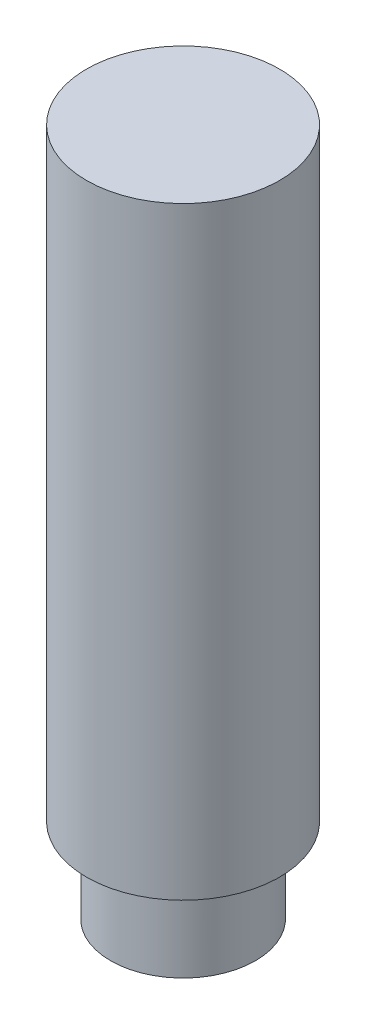
ISO-10303-21;
HEADER;
FILE_DESCRIPTION(('STEP AP214'),'2;1');
FILE_NAME('part.step','',(''),(''),'','','');
FILE_SCHEMA(('AUTOMOTIVE_DESIGN { 1 0 10303 214 1 1 1 1 }'));
ENDSEC;
DATA;
#1=APPLICATION_CONTEXT('core data for automotive mechanical design processes');
#2=APPLICATION_PROTOCOL_DEFINITION('international standard','automotive_design',2000,#1);
#3=PRODUCT_CONTEXT('',#1,'mechanical');
#4=PRODUCT('Part','Part','',(#3));
#5=PRODUCT_RELATED_PRODUCT_CATEGORY('part','',(#4));
#6=PRODUCT_DEFINITION_FORMATION('','',#4);
#7=PRODUCT_DEFINITION_CONTEXT('part definition',#1,'design');
#8=PRODUCT_DEFINITION('design','',#6,#7);
#9=PRODUCT_DEFINITION_SHAPE('','',#8);
#10=(LENGTH_UNIT() NAMED_UNIT(*) SI_UNIT(.MILLI.,.METRE.));
#11=(NAMED_UNIT(*) PLANE_ANGLE_UNIT() SI_UNIT($,.RADIAN.));
#12=(NAMED_UNIT(*) SI_UNIT($,.STERADIAN.) SOLID_ANGLE_UNIT());
#13=UNCERTAINTY_MEASURE_WITH_UNIT(LENGTH_MEASURE(1.E-05),#10,'distance_accuracy_value','');
#14=(GEOMETRIC_REPRESENTATION_CONTEXT(3) GLOBAL_UNCERTAINTY_ASSIGNED_CONTEXT((#13)) GLOBAL_UNIT_ASSIGNED_CONTEXT((#10,
#11,#12)) REPRESENTATION_CONTEXT('',''));
#15=CARTESIAN_POINT('',(0.,0.,0.));
#16=DIRECTION('',(0.,0.,1.));
#17=DIRECTION('',(1.,0.,0.));
#18=AXIS2_PLACEMENT_3D('',#15,#16,#17);
#19=CARTESIAN_POINT('',(0.,0.,0.));
#20=DIRECTION('',(0.,1.,0.));
#21=DIRECTION('',(0.,0.,1.));
#22=AXIS2_PLACEMENT_3D('',#19,#20,#21);
#23=PLANE('',#22);
#24=CARTESIAN_POINT('',(0.,0.,0.));
#25=DIRECTION('',(0.,1.,0.));
#26=DIRECTION('',(0.,0.,1.));
#27=AXIS2_PLACEMENT_3D('',#24,#25,#26);
#28=CIRCLE('',#27,4.);
#29=CARTESIAN_POINT('',(0.,0.,4.));
#30=VERTEX_POINT('',#29);
#31=EDGE_CURVE('E41',#30,#30,#28,.T.);
#32=ORIENTED_EDGE('',*,*,#31,.F.);
#33=EDGE_LOOP('',(#32));
#34=FACE_BOUND('',#33,.T.);
#35=CARTESIAN_POINT('',(0.,0.,0.));
#36=DIRECTION('',(0.,1.,0.));
#37=DIRECTION('',(0.,0.,1.));
#38=AXIS2_PLACEMENT_3D('',#35,#36,#37);
#39=CIRCLE('',#38,3.);
#40=CARTESIAN_POINT('',(0.,0.,3.));
#41=VERTEX_POINT('',#40);
#42=EDGE_CURVE('E10',#41,#41,#39,.F.);
#43=ORIENTED_EDGE('',*,*,#42,.F.);
#44=EDGE_LOOP('',(#43));
#45=FACE_BOUND('',#44,.T.);
#46=ADVANCED_FACE('F30',(#34,#45),#23,.F.);
#47=CARTESIAN_POINT('',(0.,25.,0.));
#48=DIRECTION('',(0.,-1.,0.));
#49=DIRECTION('',(0.,0.,-1.));
#50=AXIS2_PLACEMENT_3D('',#47,#48,#49);
#51=CYLINDRICAL_SURFACE('',#50,4.);
#52=CARTESIAN_POINT('',(0.,25.,0.));
#53=DIRECTION('',(0.,1.,0.));
#54=DIRECTION('',(0.,0.,1.));
#55=AXIS2_PLACEMENT_3D('',#52,#53,#54);
#56=CIRCLE('',#55,4.);
#57=CARTESIAN_POINT('',(0.,25.,4.));
#58=VERTEX_POINT('',#57);
#59=EDGE_CURVE('E37',#58,#58,#56,.T.);
#60=ORIENTED_EDGE('',*,*,#59,.F.);
#61=EDGE_LOOP('',(#60));
#62=FACE_BOUND('',#61,.T.);
#63=ORIENTED_EDGE('',*,*,#31,.T.);
#64=EDGE_LOOP('',(#63));
#65=FACE_BOUND('',#64,.T.);
#66=ADVANCED_FACE('F32',(#62,#65),#51,.T.);
#67=CARTESIAN_POINT('',(0.,25.,0.));
#68=DIRECTION('',(0.,1.,0.));
#69=DIRECTION('',(0.,0.,1.));
#70=AXIS2_PLACEMENT_3D('',#67,#68,#69);
#71=PLANE('',#70);
#72=ORIENTED_EDGE('',*,*,#59,.T.);
#73=EDGE_LOOP('',(#72));
#74=FACE_BOUND('',#73,.T.);
#75=ADVANCED_FACE('F55',(#74),#71,.T.);
#76=CARTESIAN_POINT('',(0.,-3.5,0.));
#77=DIRECTION('',(0.,1.,0.));
#78=DIRECTION('',(0.,0.,1.));
#79=AXIS2_PLACEMENT_3D('',#76,#77,#78);
#80=CYLINDRICAL_SURFACE('',#79,3.);
#81=CARTESIAN_POINT('',(0.,-3.5,0.));
#82=DIRECTION('',(0.,-1.,0.));
#83=DIRECTION('',(0.,0.,-1.));
#84=AXIS2_PLACEMENT_3D('',#81,#82,#83);
#85=CIRCLE('',#84,3.);
#86=CARTESIAN_POINT('',(0.,-3.5,-3.));
#87=VERTEX_POINT('',#86);
#88=EDGE_CURVE('E46',#87,#87,#85,.T.);
#89=ORIENTED_EDGE('',*,*,#88,.F.);
#90=EDGE_LOOP('',(#89));
#91=FACE_BOUND('',#90,.T.);
#92=ORIENTED_EDGE('',*,*,#42,.T.);
#93=EDGE_LOOP('',(#92));
#94=FACE_BOUND('',#93,.T.);
#95=ADVANCED_FACE('F53',(#91,#94),#80,.T.);
#96=CARTESIAN_POINT('',(0.,-3.5,0.));
#97=DIRECTION('',(0.,-1.,0.));
#98=DIRECTION('',(0.,0.,-1.));
#99=AXIS2_PLACEMENT_3D('',#96,#97,#98);
#100=PLANE('',#99);
#101=ORIENTED_EDGE('',*,*,#88,.T.);
#102=EDGE_LOOP('',(#101));
#103=FACE_BOUND('',#102,.T.);
#104=ADVANCED_FACE('F51',(#103),#100,.T.);
#105=CLOSED_SHELL('',(#46,#66,#75,#95,#104));
#106=MANIFOLD_SOLID_BREP('B2',#105);
#107=ADVANCED_BREP_SHAPE_REPRESENTATION('',(#18,#106),#14);
#108=SHAPE_DEFINITION_REPRESENTATION(#9,#107);
ENDSEC;
END-ISO-10303-21;
